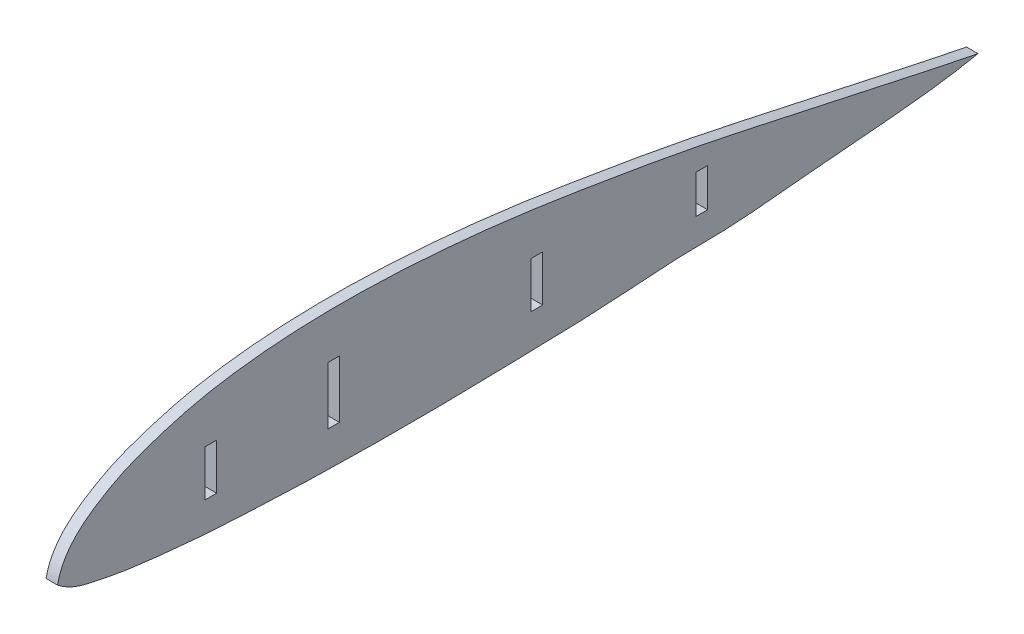
ISO-10303-21;
HEADER;
FILE_DESCRIPTION(('STEP AP214'),'2;1');
FILE_NAME('part.step','',(''),(''),'','','');
FILE_SCHEMA(('AUTOMOTIVE_DESIGN { 1 0 10303 214 1 1 1 1 }'));
ENDSEC;
DATA;
#1=APPLICATION_CONTEXT('core data for automotive mechanical design processes');
#2=APPLICATION_PROTOCOL_DEFINITION('international standard','automotive_design',2000,#1);
#3=PRODUCT_CONTEXT('',#1,'mechanical');
#4=PRODUCT('Part','Part','',(#3));
#5=PRODUCT_RELATED_PRODUCT_CATEGORY('part','',(#4));
#6=PRODUCT_DEFINITION_FORMATION('','',#4);
#7=PRODUCT_DEFINITION_CONTEXT('part definition',#1,'design');
#8=PRODUCT_DEFINITION('design','',#6,#7);
#9=PRODUCT_DEFINITION_SHAPE('','',#8);
#10=(LENGTH_UNIT() NAMED_UNIT(*) SI_UNIT(.MILLI.,.METRE.));
#11=(NAMED_UNIT(*) PLANE_ANGLE_UNIT() SI_UNIT($,.RADIAN.));
#12=(NAMED_UNIT(*) SI_UNIT($,.STERADIAN.) SOLID_ANGLE_UNIT());
#13=UNCERTAINTY_MEASURE_WITH_UNIT(LENGTH_MEASURE(1.E-05),#10,'distance_accuracy_value','');
#14=(GEOMETRIC_REPRESENTATION_CONTEXT(3) GLOBAL_UNCERTAINTY_ASSIGNED_CONTEXT((#13)) GLOBAL_UNIT_ASSIGNED_CONTEXT((#10,
#11,#12)) REPRESENTATION_CONTEXT('',''));
#15=CARTESIAN_POINT('',(0.,0.,0.));
#16=DIRECTION('',(0.,0.,1.));
#17=DIRECTION('',(1.,0.,0.));
#18=AXIS2_PLACEMENT_3D('',#15,#16,#17);
#19=CARTESIAN_POINT('',(3.,0.,240.));
#20=CARTESIAN_POINT('',(3.,-2.88663712280927,236.523911789921));
#21=CARTESIAN_POINT('',(3.,-4.06778606087941,230.220810861395));
#22=CARTESIAN_POINT('',(3.,-5.64877990651582,222.028601874124));
#23=CARTESIAN_POINT('',(3.,-6.60851401532716,214.009642515101));
#24=CARTESIAN_POINT('',(3.,-7.65058139006474,204.019456847261));
#25=CARTESIAN_POINT('',(3.,-8.62100436946901,188.0105436438));
#26=CARTESIAN_POINT('',(3.,-9.35502805275515,168.008371033474));
#27=CARTESIAN_POINT('',(3.,-9.54465584837777,143.997445941081));
#28=CARTESIAN_POINT('',(3.,-9.00057164569615,119.996434597562));
#29=CARTESIAN_POINT('',(3.,-8.45231331914167,95.9841207137069));
#30=CARTESIAN_POINT('',(3.,-6.86154925632092,79.4444514819222));
#31=CARTESIAN_POINT('',(3.,-6.94135781790873,63.4128510279465));
#32=CARTESIAN_POINT('',(3.,-5.14929657813988,47.4214800178839));
#33=CARTESIAN_POINT('',(3.,-3.34616289016771,23.9519910613881));
#34=CARTESIAN_POINT('',(3.,-1.67223814751534,7.91601145609598));
#35=CARTESIAN_POINT('',(3.,0.,0.));
#36=B_SPLINE_CURVE_WITH_KNOTS('',3,(#19,#20,#21,#22,#23,#24,#25,#26,#27,#28,#29,#30,#31,#32,#33,
#34,#35),.UNSPECIFIED.,.F.,.F.,(4,1,1,1,1,1,1,1,1,1,1,1,1,1,4),(0.,0.0534752742490124,
0.078709310431568,0.103753203869046,0.153672751320013,0.203448048800785,0.302856430572072,
0.402198969890009,0.501554024856561,0.600954522211836,0.700430480598882,0.70748041607058,
0.79999645484155,0.899715684831644,1.),.UNSPECIFIED.);
#37=DIRECTION('',(-1.,0.,0.));
#38=VECTOR('',#37,1.);
#39=SURFACE_OF_LINEAR_EXTRUSION('',#36,#38);
#40=CARTESIAN_POINT('',(0.,0.,240.));
#41=CARTESIAN_POINT('',(0.,-2.88663712280927,236.523911789921));
#42=CARTESIAN_POINT('',(0.,-4.06778606087941,230.220810861395));
#43=CARTESIAN_POINT('',(0.,-5.64877990651582,222.028601874124));
#44=CARTESIAN_POINT('',(0.,-6.60851401532716,214.009642515101));
#45=CARTESIAN_POINT('',(0.,-7.65058139006474,204.019456847261));
#46=CARTESIAN_POINT('',(0.,-8.62100436946901,188.0105436438));
#47=CARTESIAN_POINT('',(0.,-9.35502805275515,168.008371033474));
#48=CARTESIAN_POINT('',(0.,-9.54465584837777,143.997445941081));
#49=CARTESIAN_POINT('',(0.,-9.00057164569615,119.996434597562));
#50=CARTESIAN_POINT('',(0.,-8.45231331914167,95.9841207137069));
#51=CARTESIAN_POINT('',(0.,-6.86154925632092,79.4444514819222));
#52=CARTESIAN_POINT('',(0.,-6.94135781790873,63.4128510279465));
#53=CARTESIAN_POINT('',(0.,-5.14929657813988,47.4214800178839));
#54=CARTESIAN_POINT('',(0.,-3.34616289016771,23.9519910613881));
#55=CARTESIAN_POINT('',(0.,-1.67223814751534,7.91601145609598));
#56=CARTESIAN_POINT('',(0.,0.,0.));
#57=B_SPLINE_CURVE_WITH_KNOTS('',3,(#40,#41,#42,#43,#44,#45,#46,#47,#48,#49,#50,#51,#52,#53,#54,
#55,#56),.UNSPECIFIED.,.F.,.F.,(4,1,1,1,1,1,1,1,1,1,1,1,1,1,4),(0.,0.0534752742490124,
0.078709310431568,0.103753203869046,0.153672751320013,0.203448048800785,0.302856430572072,
0.402198969890009,0.501554024856561,0.600954522211836,0.700430480598882,0.70748041607058,
0.79999645484155,0.899715684831644,1.),.UNSPECIFIED.);
#58=CARTESIAN_POINT('',(0.,0.,240.));
#59=VERTEX_POINT('',#58);
#60=CARTESIAN_POINT('',(0.,0.,0.));
#61=VERTEX_POINT('',#60);
#62=EDGE_CURVE('E292',#59,#61,#57,.T.);
#63=ORIENTED_EDGE('',*,*,#62,.T.);
#64=DIRECTION('',(-1.,0.,0.));
#65=VECTOR('',#64,1.);
#66=CARTESIAN_POINT('',(3.,0.,0.));
#67=LINE('',#66,#65);
#68=CARTESIAN_POINT('',(3.,0.,0.));
#69=VERTEX_POINT('',#68);
#70=EDGE_CURVE('E11',#69,#61,#67,.T.);
#71=ORIENTED_EDGE('',*,*,#70,.F.);
#72=CARTESIAN_POINT('',(3.,0.,240.));
#73=VERTEX_POINT('',#72);
#74=EDGE_CURVE('E298',#73,#69,#36,.T.);
#75=ORIENTED_EDGE('',*,*,#74,.F.);
#76=DIRECTION('',(-1.,0.,0.));
#77=VECTOR('',#76,1.);
#78=CARTESIAN_POINT('',(3.,0.,240.));
#79=LINE('',#78,#77);
#80=EDGE_CURVE('E50',#73,#59,#79,.T.);
#81=ORIENTED_EDGE('',*,*,#80,.T.);
#82=EDGE_LOOP('',(#63,#71,#75,#81));
#83=FACE_BOUND('',#82,.T.);
#84=ADVANCED_FACE('F42',(#83),#39,.F.);
#85=CARTESIAN_POINT('',(3.,0.,0.));
#86=CARTESIAN_POINT('',(3.,1.52360068225762,8.03746926130975));
#87=CARTESIAN_POINT('',(3.,5.17138323074117,23.9897917168263));
#88=CARTESIAN_POINT('',(3.,10.2205786034995,48.0059783922376));
#89=CARTESIAN_POINT('',(3.,15.5619770262737,71.9126579513757));
#90=CARTESIAN_POINT('',(3.,19.7588120032883,95.9537600079154));
#91=CARTESIAN_POINT('',(3.,23.5677508672796,119.918298993928));
#92=CARTESIAN_POINT('',(3.,26.0263882263808,143.945589986485));
#93=CARTESIAN_POINT('',(3.,26.9601439821251,168.007150596988));
#94=CARTESIAN_POINT('',(3.,25.8933216802265,188.104616678397));
#95=CARTESIAN_POINT('',(3.,23.2639042392419,204.156129060536));
#96=CARTESIAN_POINT('',(3.,20.3434828261758,214.111867769092));
#97=CARTESIAN_POINT('',(3.,17.4120912155664,222.175332594537));
#98=CARTESIAN_POINT('',(3.,12.3378274401084,231.611968899749));
#99=CARTESIAN_POINT('',(3.,6.88597595591278,238.539586147514));
#100=CARTESIAN_POINT('',(3.,0.,240.));
#101=B_SPLINE_CURVE_WITH_KNOTS('',3,(#85,#86,#87,#88,#89,#90,#91,#92,#93,#94,#95,#96,#97,#98,
#99,#100),.UNSPECIFIED.,.F.,.F.,(4,1,1,1,1,1,1,1,1,1,1,1,1,4),(0.,0.0976537739938577,
0.195364998835535,0.293026196954694,0.390079704897671,0.486695277187024,0.582699676897636,
0.678273314662547,0.77397516907434,0.822435696462195,0.872109787552887,0.897672395288057,
0.924653988799848,1.),.UNSPECIFIED.);
#102=DIRECTION('',(-1.,0.,0.));
#103=VECTOR('',#102,1.);
#104=SURFACE_OF_LINEAR_EXTRUSION('',#101,#103);
#105=CARTESIAN_POINT('',(0.,0.,0.));
#106=CARTESIAN_POINT('',(0.,1.52360068225762,8.03746926130975));
#107=CARTESIAN_POINT('',(0.,5.17138323074117,23.9897917168263));
#108=CARTESIAN_POINT('',(0.,10.2205786034995,48.0059783922376));
#109=CARTESIAN_POINT('',(0.,15.5619770262737,71.9126579513757));
#110=CARTESIAN_POINT('',(0.,19.7588120032883,95.9537600079154));
#111=CARTESIAN_POINT('',(0.,23.5677508672796,119.918298993928));
#112=CARTESIAN_POINT('',(0.,26.0263882263808,143.945589986485));
#113=CARTESIAN_POINT('',(0.,26.9601439821251,168.007150596988));
#114=CARTESIAN_POINT('',(0.,25.8933216802265,188.104616678397));
#115=CARTESIAN_POINT('',(0.,23.2639042392419,204.156129060536));
#116=CARTESIAN_POINT('',(0.,20.3434828261758,214.111867769092));
#117=CARTESIAN_POINT('',(0.,17.4120912155664,222.175332594537));
#118=CARTESIAN_POINT('',(0.,12.3378274401084,231.611968899749));
#119=CARTESIAN_POINT('',(0.,6.88597595591278,238.539586147514));
#120=CARTESIAN_POINT('',(0.,0.,240.));
#121=B_SPLINE_CURVE_WITH_KNOTS('',3,(#105,#106,#107,#108,#109,#110,#111,#112,#113,#114,#115,
#116,#117,#118,#119,#120),.UNSPECIFIED.,.F.,.F.,(4,1,1,1,1,1,1,1,1,1,1,1,1,4),(0.,
0.0976537739938577,0.195364998835535,0.293026196954694,0.390079704897671,0.486695277187024,
0.582699676897636,0.678273314662547,0.77397516907434,0.822435696462195,0.872109787552887,
0.897672395288057,0.924653988799848,1.),.UNSPECIFIED.);
#122=EDGE_CURVE('E305',#61,#59,#121,.T.);
#123=ORIENTED_EDGE('',*,*,#122,.T.);
#124=ORIENTED_EDGE('',*,*,#80,.F.);
#125=EDGE_CURVE('E304',#69,#73,#101,.T.);
#126=ORIENTED_EDGE('',*,*,#125,.F.);
#127=ORIENTED_EDGE('',*,*,#70,.T.);
#128=EDGE_LOOP('',(#123,#124,#126,#127));
#129=FACE_BOUND('',#128,.T.);
#130=ADVANCED_FACE('F319',(#129),#104,.F.);
#131=CARTESIAN_POINT('',(3.,-9.00853891874286,120.375365675922));
#132=DIRECTION('',(-1.,0.,0.));
#133=DIRECTION('',(0.,0.,1.));
#134=AXIS2_PLACEMENT_3D('',#131,#132,#133);
#135=PLANE('',#134);
#136=DIRECTION('',(0.,1.,0.));
#137=VECTOR('',#136,1.);
#138=CARTESIAN_POINT('',(3.,10.,73.5));
#139=LINE('',#138,#137);
#140=CARTESIAN_POINT('',(3.,0.,73.5));
#141=VERTEX_POINT('',#140);
#142=CARTESIAN_POINT('',(3.,10.,73.5));
#143=VERTEX_POINT('',#142);
#144=EDGE_CURVE('E243',#141,#143,#139,.T.);
#145=ORIENTED_EDGE('',*,*,#144,.T.);
#146=DIRECTION('',(0.,0.,-1.));
#147=VECTOR('',#146,1.);
#148=CARTESIAN_POINT('',(3.,10.,70.5));
#149=LINE('',#148,#147);
#150=CARTESIAN_POINT('',(3.,10.,70.5));
#151=VERTEX_POINT('',#150);
#152=EDGE_CURVE('E254',#143,#151,#149,.T.);
#153=ORIENTED_EDGE('',*,*,#152,.T.);
#154=DIRECTION('',(0.,-1.,0.));
#155=VECTOR('',#154,1.);
#156=CARTESIAN_POINT('',(3.,0.,70.5));
#157=LINE('',#156,#155);
#158=CARTESIAN_POINT('',(3.,0.,70.5));
#159=VERTEX_POINT('',#158);
#160=EDGE_CURVE('E264',#151,#159,#157,.T.);
#161=ORIENTED_EDGE('',*,*,#160,.T.);
#162=DIRECTION('',(0.,0.,1.));
#163=VECTOR('',#162,1.);
#164=CARTESIAN_POINT('',(3.,0.,70.5));
#165=LINE('',#164,#163);
#166=EDGE_CURVE('E57',#159,#141,#165,.T.);
#167=ORIENTED_EDGE('',*,*,#166,.T.);
#168=EDGE_LOOP('',(#145,#153,#161,#167));
#169=FACE_BOUND('',#168,.T.);
#170=DIRECTION('',(0.,0.,1.));
#171=VECTOR('',#170,1.);
#172=CARTESIAN_POINT('',(3.,0.,201.5));
#173=LINE('',#172,#171);
#174=CARTESIAN_POINT('',(3.,0.,198.5));
#175=VERTEX_POINT('',#174);
#176=CARTESIAN_POINT('',(3.,0.,201.5));
#177=VERTEX_POINT('',#176);
#178=EDGE_CURVE('E213',#175,#177,#173,.T.);
#179=ORIENTED_EDGE('',*,*,#178,.T.);
#180=DIRECTION('',(0.,1.,0.));
#181=VECTOR('',#180,1.);
#182=CARTESIAN_POINT('',(3.,12.,201.5));
#183=LINE('',#182,#181);
#184=CARTESIAN_POINT('',(3.,12.,201.5));
#185=VERTEX_POINT('',#184);
#186=EDGE_CURVE('E225',#177,#185,#183,.T.);
#187=ORIENTED_EDGE('',*,*,#186,.T.);
#188=DIRECTION('',(0.,0.,-1.));
#189=VECTOR('',#188,1.);
#190=CARTESIAN_POINT('',(3.,12.,198.5));
#191=LINE('',#190,#189);
#192=CARTESIAN_POINT('',(3.,12.,198.5));
#193=VERTEX_POINT('',#192);
#194=EDGE_CURVE('E235',#185,#193,#191,.T.);
#195=ORIENTED_EDGE('',*,*,#194,.T.);
#196=DIRECTION('',(0.,-1.,0.));
#197=VECTOR('',#196,1.);
#198=CARTESIAN_POINT('',(3.,0.,198.5));
#199=LINE('',#198,#197);
#200=EDGE_CURVE('E65',#193,#175,#199,.T.);
#201=ORIENTED_EDGE('',*,*,#200,.T.);
#202=EDGE_LOOP('',(#179,#187,#195,#201));
#203=FACE_BOUND('',#202,.T.);
#204=DIRECTION('',(0.,-1.,0.));
#205=VECTOR('',#204,1.);
#206=CARTESIAN_POINT('',(3.,15.,166.5));
#207=LINE('',#206,#205);
#208=CARTESIAN_POINT('',(3.,15.,166.5));
#209=VERTEX_POINT('',#208);
#210=CARTESIAN_POINT('',(3.,0.,166.5));
#211=VERTEX_POINT('',#210);
#212=EDGE_CURVE('E200',#209,#211,#207,.T.);
#213=ORIENTED_EDGE('',*,*,#212,.T.);
#214=DIRECTION('',(0.,0.,1.));
#215=VECTOR('',#214,1.);
#216=CARTESIAN_POINT('',(3.,0.,166.5));
#217=LINE('',#216,#215);
#218=CARTESIAN_POINT('',(3.,0.,169.5));
#219=VERTEX_POINT('',#218);
#220=EDGE_CURVE('E173',#211,#219,#217,.T.);
#221=ORIENTED_EDGE('',*,*,#220,.T.);
#222=DIRECTION('',(0.,1.,0.));
#223=VECTOR('',#222,1.);
#224=CARTESIAN_POINT('',(3.,0.,169.5));
#225=LINE('',#224,#223);
#226=CARTESIAN_POINT('',(3.,15.,169.5));
#227=VERTEX_POINT('',#226);
#228=EDGE_CURVE('E206',#219,#227,#225,.T.);
#229=ORIENTED_EDGE('',*,*,#228,.T.);
#230=DIRECTION('',(0.,0.,-1.));
#231=VECTOR('',#230,1.);
#232=CARTESIAN_POINT('',(3.,15.,169.5));
#233=LINE('',#232,#231);
#234=EDGE_CURVE('E202',#227,#209,#233,.T.);
#235=ORIENTED_EDGE('',*,*,#234,.T.);
#236=EDGE_LOOP('',(#213,#221,#229,#235));
#237=FACE_BOUND('',#236,.T.);
#238=DIRECTION('',(0.,1.,0.));
#239=VECTOR('',#238,1.);
#240=CARTESIAN_POINT('',(3.,0.,116.5));
#241=LINE('',#240,#239);
#242=CARTESIAN_POINT('',(3.,0.,116.5));
#243=VERTEX_POINT('',#242);
#244=CARTESIAN_POINT('',(3.,12.,116.5));
#245=VERTEX_POINT('',#244);
#246=EDGE_CURVE('E279',#243,#245,#241,.T.);
#247=ORIENTED_EDGE('',*,*,#246,.T.);
#248=DIRECTION('',(0.,0.,-1.));
#249=VECTOR('',#248,1.);
#250=CARTESIAN_POINT('',(3.,12.,116.5));
#251=LINE('',#250,#249);
#252=CARTESIAN_POINT('',(3.,12.,113.5));
#253=VERTEX_POINT('',#252);
#254=EDGE_CURVE('E269',#245,#253,#251,.T.);
#255=ORIENTED_EDGE('',*,*,#254,.T.);
#256=DIRECTION('',(0.,-1.,0.));
#257=VECTOR('',#256,1.);
#258=CARTESIAN_POINT('',(3.,12.,113.5));
#259=LINE('',#258,#257);
#260=CARTESIAN_POINT('',(3.,0.,113.5));
#261=VERTEX_POINT('',#260);
#262=EDGE_CURVE('E272',#253,#261,#259,.T.);
#263=ORIENTED_EDGE('',*,*,#262,.T.);
#264=DIRECTION('',(0.,0.,1.));
#265=VECTOR('',#264,1.);
#266=CARTESIAN_POINT('',(3.,0.,116.5));
#267=LINE('',#266,#265);
#268=EDGE_CURVE('E276',#261,#243,#267,.T.);
#269=ORIENTED_EDGE('',*,*,#268,.T.);
#270=EDGE_LOOP('',(#247,#255,#263,#269));
#271=FACE_BOUND('',#270,.T.);
#272=ORIENTED_EDGE('',*,*,#74,.T.);
#273=ORIENTED_EDGE('',*,*,#125,.T.);
#274=EDGE_LOOP('',(#272,#273));
#275=FACE_BOUND('',#274,.T.);
#276=ADVANCED_FACE('F322',(#169,#203,#237,#271,#275),#135,.F.);
#277=CARTESIAN_POINT('',(0.,-9.00853891874286,120.375365675922));
#278=DIRECTION('',(-1.,0.,0.));
#279=DIRECTION('',(0.,0.,1.));
#280=AXIS2_PLACEMENT_3D('',#277,#278,#279);
#281=PLANE('',#280);
#282=DIRECTION('',(0.,0.,-1.));
#283=VECTOR('',#282,1.);
#284=CARTESIAN_POINT('',(0.,10.,70.5));
#285=LINE('',#284,#283);
#286=CARTESIAN_POINT('',(0.,10.,73.5));
#287=VERTEX_POINT('',#286);
#288=CARTESIAN_POINT('',(0.,10.,70.5));
#289=VERTEX_POINT('',#288);
#290=EDGE_CURVE('E220',#287,#289,#285,.T.);
#291=ORIENTED_EDGE('',*,*,#290,.F.);
#292=DIRECTION('',(0.,1.,0.));
#293=VECTOR('',#292,1.);
#294=CARTESIAN_POINT('',(0.,10.,73.5));
#295=LINE('',#294,#293);
#296=CARTESIAN_POINT('',(0.,0.,73.5));
#297=VERTEX_POINT('',#296);
#298=EDGE_CURVE('E250',#297,#287,#295,.T.);
#299=ORIENTED_EDGE('',*,*,#298,.F.);
#300=DIRECTION('',(0.,0.,1.));
#301=VECTOR('',#300,1.);
#302=CARTESIAN_POINT('',(0.,0.,70.5));
#303=LINE('',#302,#301);
#304=CARTESIAN_POINT('',(0.,0.,70.5));
#305=VERTEX_POINT('',#304);
#306=EDGE_CURVE('E253',#305,#297,#303,.T.);
#307=ORIENTED_EDGE('',*,*,#306,.F.);
#308=DIRECTION('',(0.,-1.,0.));
#309=VECTOR('',#308,1.);
#310=CARTESIAN_POINT('',(0.,0.,70.5));
#311=LINE('',#310,#309);
#312=EDGE_CURVE('E257',#289,#305,#311,.T.);
#313=ORIENTED_EDGE('',*,*,#312,.F.);
#314=EDGE_LOOP('',(#291,#299,#307,#313));
#315=FACE_BOUND('',#314,.T.);
#316=DIRECTION('',(0.,1.,0.));
#317=VECTOR('',#316,1.);
#318=CARTESIAN_POINT('',(0.,12.,201.5));
#319=LINE('',#318,#317);
#320=CARTESIAN_POINT('',(0.,0.,201.5));
#321=VERTEX_POINT('',#320);
#322=CARTESIAN_POINT('',(0.,12.,201.5));
#323=VERTEX_POINT('',#322);
#324=EDGE_CURVE('E178',#321,#323,#319,.T.);
#325=ORIENTED_EDGE('',*,*,#324,.F.);
#326=DIRECTION('',(0.,0.,1.));
#327=VECTOR('',#326,1.);
#328=CARTESIAN_POINT('',(0.,0.,201.5));
#329=LINE('',#328,#327);
#330=CARTESIAN_POINT('',(0.,0.,198.5));
#331=VERTEX_POINT('',#330);
#332=EDGE_CURVE('E221',#331,#321,#329,.T.);
#333=ORIENTED_EDGE('',*,*,#332,.F.);
#334=DIRECTION('',(0.,-1.,0.));
#335=VECTOR('',#334,1.);
#336=CARTESIAN_POINT('',(0.,0.,198.5));
#337=LINE('',#336,#335);
#338=CARTESIAN_POINT('',(0.,12.,198.5));
#339=VERTEX_POINT('',#338);
#340=EDGE_CURVE('E224',#339,#331,#337,.T.);
#341=ORIENTED_EDGE('',*,*,#340,.F.);
#342=DIRECTION('',(0.,0.,-1.));
#343=VECTOR('',#342,1.);
#344=CARTESIAN_POINT('',(0.,12.,198.5));
#345=LINE('',#344,#343);
#346=EDGE_CURVE('E228',#323,#339,#345,.T.);
#347=ORIENTED_EDGE('',*,*,#346,.F.);
#348=EDGE_LOOP('',(#325,#333,#341,#347));
#349=FACE_BOUND('',#348,.T.);
#350=DIRECTION('',(0.,0.,1.));
#351=VECTOR('',#350,1.);
#352=CARTESIAN_POINT('',(0.,0.,166.5));
#353=LINE('',#352,#351);
#354=CARTESIAN_POINT('',(0.,0.,166.5));
#355=VERTEX_POINT('',#354);
#356=CARTESIAN_POINT('',(0.,0.,169.5));
#357=VERTEX_POINT('',#356);
#358=EDGE_CURVE('E170',#355,#357,#353,.T.);
#359=ORIENTED_EDGE('',*,*,#358,.F.);
#360=DIRECTION('',(0.,-1.,0.));
#361=VECTOR('',#360,1.);
#362=CARTESIAN_POINT('',(0.,15.,166.5));
#363=LINE('',#362,#361);
#364=CARTESIAN_POINT('',(0.,15.,166.5));
#365=VERTEX_POINT('',#364);
#366=EDGE_CURVE('E181',#365,#355,#363,.T.);
#367=ORIENTED_EDGE('',*,*,#366,.F.);
#368=DIRECTION('',(0.,0.,-1.));
#369=VECTOR('',#368,1.);
#370=CARTESIAN_POINT('',(0.,15.,169.5));
#371=LINE('',#370,#369);
#372=CARTESIAN_POINT('',(0.,15.,169.5));
#373=VERTEX_POINT('',#372);
#374=EDGE_CURVE('E186',#373,#365,#371,.T.);
#375=ORIENTED_EDGE('',*,*,#374,.F.);
#376=DIRECTION('',(0.,1.,0.));
#377=VECTOR('',#376,1.);
#378=CARTESIAN_POINT('',(0.,0.,169.5));
#379=LINE('',#378,#377);
#380=EDGE_CURVE('E192',#357,#373,#379,.T.);
#381=ORIENTED_EDGE('',*,*,#380,.F.);
#382=EDGE_LOOP('',(#359,#367,#375,#381));
#383=FACE_BOUND('',#382,.T.);
#384=DIRECTION('',(0.,0.,-1.));
#385=VECTOR('',#384,1.);
#386=CARTESIAN_POINT('',(0.,12.,116.5));
#387=LINE('',#386,#385);
#388=CARTESIAN_POINT('',(0.,12.,116.5));
#389=VERTEX_POINT('',#388);
#390=CARTESIAN_POINT('',(0.,12.,113.5));
#391=VERTEX_POINT('',#390);
#392=EDGE_CURVE('E193',#389,#391,#387,.T.);
#393=ORIENTED_EDGE('',*,*,#392,.F.);
#394=DIRECTION('',(0.,1.,0.));
#395=VECTOR('',#394,1.);
#396=CARTESIAN_POINT('',(0.,0.,116.5));
#397=LINE('',#396,#395);
#398=CARTESIAN_POINT('',(0.,0.,116.5));
#399=VERTEX_POINT('',#398);
#400=EDGE_CURVE('E273',#399,#389,#397,.T.);
#401=ORIENTED_EDGE('',*,*,#400,.F.);
#402=DIRECTION('',(0.,0.,1.));
#403=VECTOR('',#402,1.);
#404=CARTESIAN_POINT('',(0.,0.,116.5));
#405=LINE('',#404,#403);
#406=CARTESIAN_POINT('',(0.,0.,113.5));
#407=VERTEX_POINT('',#406);
#408=EDGE_CURVE('E285',#407,#399,#405,.T.);
#409=ORIENTED_EDGE('',*,*,#408,.F.);
#410=DIRECTION('',(0.,-1.,0.));
#411=VECTOR('',#410,1.);
#412=CARTESIAN_POINT('',(0.,12.,113.5));
#413=LINE('',#412,#411);
#414=EDGE_CURVE('E195',#391,#407,#413,.T.);
#415=ORIENTED_EDGE('',*,*,#414,.F.);
#416=EDGE_LOOP('',(#393,#401,#409,#415));
#417=FACE_BOUND('',#416,.T.);
#418=ORIENTED_EDGE('',*,*,#62,.F.);
#419=ORIENTED_EDGE('',*,*,#122,.F.);
#420=EDGE_LOOP('',(#418,#419));
#421=FACE_BOUND('',#420,.T.);
#422=ADVANCED_FACE('F189',(#315,#349,#383,#417,#421),#281,.T.);
#423=CARTESIAN_POINT('',(3.,12.,116.5));
#424=DIRECTION('',(0.,1.,0.));
#425=DIRECTION('',(0.,0.,1.));
#426=AXIS2_PLACEMENT_3D('',#423,#424,#425);
#427=PLANE('',#426);
#428=ORIENTED_EDGE('',*,*,#392,.T.);
#429=DIRECTION('',(-1.,0.,0.));
#430=VECTOR('',#429,1.);
#431=CARTESIAN_POINT('',(3.,12.,113.5));
#432=LINE('',#431,#430);
#433=EDGE_CURVE('E281',#253,#391,#432,.T.);
#434=ORIENTED_EDGE('',*,*,#433,.F.);
#435=ORIENTED_EDGE('',*,*,#254,.F.);
#436=DIRECTION('',(-1.,0.,0.));
#437=VECTOR('',#436,1.);
#438=CARTESIAN_POINT('',(3.,12.,116.5));
#439=LINE('',#438,#437);
#440=EDGE_CURVE('E290',#245,#389,#439,.T.);
#441=ORIENTED_EDGE('',*,*,#440,.T.);
#442=EDGE_LOOP('',(#428,#434,#435,#441));
#443=FACE_BOUND('',#442,.T.);
#444=ADVANCED_FACE('F326',(#443),#427,.F.);
#445=CARTESIAN_POINT('',(3.,0.,116.5));
#446=DIRECTION('',(0.,0.,1.));
#447=DIRECTION('',(1.,0.,0.));
#448=AXIS2_PLACEMENT_3D('',#445,#446,#447);
#449=PLANE('',#448);
#450=ORIENTED_EDGE('',*,*,#400,.T.);
#451=ORIENTED_EDGE('',*,*,#440,.F.);
#452=ORIENTED_EDGE('',*,*,#246,.F.);
#453=DIRECTION('',(-1.,0.,0.));
#454=VECTOR('',#453,1.);
#455=CARTESIAN_POINT('',(3.,0.,116.5));
#456=LINE('',#455,#454);
#457=EDGE_CURVE('E293',#243,#399,#456,.T.);
#458=ORIENTED_EDGE('',*,*,#457,.T.);
#459=EDGE_LOOP('',(#450,#451,#452,#458));
#460=FACE_BOUND('',#459,.T.);
#461=ADVANCED_FACE('F333',(#460),#449,.F.);
#462=CARTESIAN_POINT('',(3.,0.,116.5));
#463=DIRECTION('',(0.,-1.,0.));
#464=DIRECTION('',(0.,0.,-1.));
#465=AXIS2_PLACEMENT_3D('',#462,#463,#464);
#466=PLANE('',#465);
#467=ORIENTED_EDGE('',*,*,#408,.T.);
#468=ORIENTED_EDGE('',*,*,#457,.F.);
#469=ORIENTED_EDGE('',*,*,#268,.F.);
#470=DIRECTION('',(-1.,0.,0.));
#471=VECTOR('',#470,1.);
#472=CARTESIAN_POINT('',(3.,0.,113.5));
#473=LINE('',#472,#471);
#474=EDGE_CURVE('E295',#261,#407,#473,.T.);
#475=ORIENTED_EDGE('',*,*,#474,.T.);
#476=EDGE_LOOP('',(#467,#468,#469,#475));
#477=FACE_BOUND('',#476,.T.);
#478=ADVANCED_FACE('F338',(#477),#466,.F.);
#479=CARTESIAN_POINT('',(3.,12.,113.5));
#480=DIRECTION('',(0.,0.,-1.));
#481=DIRECTION('',(-1.,0.,0.));
#482=AXIS2_PLACEMENT_3D('',#479,#480,#481);
#483=PLANE('',#482);
#484=ORIENTED_EDGE('',*,*,#414,.T.);
#485=ORIENTED_EDGE('',*,*,#474,.F.);
#486=ORIENTED_EDGE('',*,*,#262,.F.);
#487=ORIENTED_EDGE('',*,*,#433,.T.);
#488=EDGE_LOOP('',(#484,#485,#486,#487));
#489=FACE_BOUND('',#488,.T.);
#490=ADVANCED_FACE('F335',(#489),#483,.F.);
#491=CARTESIAN_POINT('',(3.,0.,166.5));
#492=DIRECTION('',(0.,-1.,0.));
#493=DIRECTION('',(0.,0.,-1.));
#494=AXIS2_PLACEMENT_3D('',#491,#492,#493);
#495=PLANE('',#494);
#496=ORIENTED_EDGE('',*,*,#358,.T.);
#497=DIRECTION('',(-1.,0.,0.));
#498=VECTOR('',#497,1.);
#499=CARTESIAN_POINT('',(3.,0.,169.5));
#500=LINE('',#499,#498);
#501=EDGE_CURVE('E203',#219,#357,#500,.T.);
#502=ORIENTED_EDGE('',*,*,#501,.F.);
#503=ORIENTED_EDGE('',*,*,#220,.F.);
#504=DIRECTION('',(-1.,0.,0.));
#505=VECTOR('',#504,1.);
#506=CARTESIAN_POINT('',(3.,0.,166.5));
#507=LINE('',#506,#505);
#508=EDGE_CURVE('E166',#211,#355,#507,.T.);
#509=ORIENTED_EDGE('',*,*,#508,.T.);
#510=EDGE_LOOP('',(#496,#502,#503,#509));
#511=FACE_BOUND('',#510,.T.);
#512=ADVANCED_FACE('F168',(#511),#495,.F.);
#513=CARTESIAN_POINT('',(3.,15.,166.5));
#514=DIRECTION('',(0.,0.,-1.));
#515=DIRECTION('',(-1.,0.,0.));
#516=AXIS2_PLACEMENT_3D('',#513,#514,#515);
#517=PLANE('',#516);
#518=ORIENTED_EDGE('',*,*,#366,.T.);
#519=ORIENTED_EDGE('',*,*,#508,.F.);
#520=ORIENTED_EDGE('',*,*,#212,.F.);
#521=DIRECTION('',(-1.,0.,0.));
#522=VECTOR('',#521,1.);
#523=CARTESIAN_POINT('',(3.,15.,166.5));
#524=LINE('',#523,#522);
#525=EDGE_CURVE('E177',#209,#365,#524,.T.);
#526=ORIENTED_EDGE('',*,*,#525,.T.);
#527=EDGE_LOOP('',(#518,#519,#520,#526));
#528=FACE_BOUND('',#527,.T.);
#529=ADVANCED_FACE('F182',(#528),#517,.F.);
#530=CARTESIAN_POINT('',(3.,15.,169.5));
#531=DIRECTION('',(0.,1.,0.));
#532=DIRECTION('',(0.,0.,1.));
#533=AXIS2_PLACEMENT_3D('',#530,#531,#532);
#534=PLANE('',#533);
#535=ORIENTED_EDGE('',*,*,#374,.T.);
#536=ORIENTED_EDGE('',*,*,#525,.F.);
#537=ORIENTED_EDGE('',*,*,#234,.F.);
#538=DIRECTION('',(-1.,0.,0.));
#539=VECTOR('',#538,1.);
#540=CARTESIAN_POINT('',(3.,15.,169.5));
#541=LINE('',#540,#539);
#542=EDGE_CURVE('E568',#227,#373,#541,.T.);
#543=ORIENTED_EDGE('',*,*,#542,.T.);
#544=EDGE_LOOP('',(#535,#536,#537,#543));
#545=FACE_BOUND('',#544,.T.);
#546=ADVANCED_FACE('F379',(#545),#534,.F.);
#547=CARTESIAN_POINT('',(3.,0.,169.5));
#548=DIRECTION('',(0.,0.,1.));
#549=DIRECTION('',(1.,0.,0.));
#550=AXIS2_PLACEMENT_3D('',#547,#548,#549);
#551=PLANE('',#550);
#552=ORIENTED_EDGE('',*,*,#380,.T.);
#553=ORIENTED_EDGE('',*,*,#542,.F.);
#554=ORIENTED_EDGE('',*,*,#228,.F.);
#555=ORIENTED_EDGE('',*,*,#501,.T.);
#556=EDGE_LOOP('',(#552,#553,#554,#555));
#557=FACE_BOUND('',#556,.T.);
#558=ADVANCED_FACE('F375',(#557),#551,.F.);
#559=CARTESIAN_POINT('',(3.,12.,201.5));
#560=DIRECTION('',(0.,0.,1.));
#561=DIRECTION('',(1.,0.,0.));
#562=AXIS2_PLACEMENT_3D('',#559,#560,#561);
#563=PLANE('',#562);
#564=ORIENTED_EDGE('',*,*,#324,.T.);
#565=DIRECTION('',(-1.,0.,0.));
#566=VECTOR('',#565,1.);
#567=CARTESIAN_POINT('',(3.,12.,201.5));
#568=LINE('',#567,#566);
#569=EDGE_CURVE('E210',#185,#323,#568,.T.);
#570=ORIENTED_EDGE('',*,*,#569,.F.);
#571=ORIENTED_EDGE('',*,*,#186,.F.);
#572=DIRECTION('',(-1.,0.,0.));
#573=VECTOR('',#572,1.);
#574=CARTESIAN_POINT('',(3.,0.,201.5));
#575=LINE('',#574,#573);
#576=EDGE_CURVE('E218',#177,#321,#575,.T.);
#577=ORIENTED_EDGE('',*,*,#576,.T.);
#578=EDGE_LOOP('',(#564,#570,#571,#577));
#579=FACE_BOUND('',#578,.T.);
#580=ADVANCED_FACE('F366',(#579),#563,.F.);
#581=CARTESIAN_POINT('',(3.,0.,201.5));
#582=DIRECTION('',(0.,-1.,0.));
#583=DIRECTION('',(0.,0.,-1.));
#584=AXIS2_PLACEMENT_3D('',#581,#582,#583);
#585=PLANE('',#584);
#586=ORIENTED_EDGE('',*,*,#332,.T.);
#587=ORIENTED_EDGE('',*,*,#576,.F.);
#588=ORIENTED_EDGE('',*,*,#178,.F.);
#589=DIRECTION('',(-1.,0.,0.));
#590=VECTOR('',#589,1.);
#591=CARTESIAN_POINT('',(3.,0.,198.5));
#592=LINE('',#591,#590);
#593=EDGE_CURVE('E216',#175,#331,#592,.T.);
#594=ORIENTED_EDGE('',*,*,#593,.T.);
#595=EDGE_LOOP('',(#586,#587,#588,#594));
#596=FACE_BOUND('',#595,.T.);
#597=ADVANCED_FACE('F362',(#596),#585,.F.);
#598=CARTESIAN_POINT('',(3.,0.,198.5));
#599=DIRECTION('',(0.,0.,-1.));
#600=DIRECTION('',(-1.,0.,0.));
#601=AXIS2_PLACEMENT_3D('',#598,#599,#600);
#602=PLANE('',#601);
#603=ORIENTED_EDGE('',*,*,#340,.T.);
#604=ORIENTED_EDGE('',*,*,#593,.F.);
#605=ORIENTED_EDGE('',*,*,#200,.F.);
#606=DIRECTION('',(-1.,0.,0.));
#607=VECTOR('',#606,1.);
#608=CARTESIAN_POINT('',(3.,12.,198.5));
#609=LINE('',#608,#607);
#610=EDGE_CURVE('E214',#193,#339,#609,.T.);
#611=ORIENTED_EDGE('',*,*,#610,.T.);
#612=EDGE_LOOP('',(#603,#604,#605,#611));
#613=FACE_BOUND('',#612,.T.);
#614=ADVANCED_FACE('F365',(#613),#602,.F.);
#615=CARTESIAN_POINT('',(3.,12.,198.5));
#616=DIRECTION('',(0.,1.,0.));
#617=DIRECTION('',(0.,0.,1.));
#618=AXIS2_PLACEMENT_3D('',#615,#616,#617);
#619=PLANE('',#618);
#620=ORIENTED_EDGE('',*,*,#346,.T.);
#621=ORIENTED_EDGE('',*,*,#610,.F.);
#622=ORIENTED_EDGE('',*,*,#194,.F.);
#623=ORIENTED_EDGE('',*,*,#569,.T.);
#624=EDGE_LOOP('',(#620,#621,#622,#623));
#625=FACE_BOUND('',#624,.T.);
#626=ADVANCED_FACE('F360',(#625),#619,.F.);
#627=CARTESIAN_POINT('',(3.,10.,70.5));
#628=DIRECTION('',(0.,1.,0.));
#629=DIRECTION('',(0.,0.,1.));
#630=AXIS2_PLACEMENT_3D('',#627,#628,#629);
#631=PLANE('',#630);
#632=ORIENTED_EDGE('',*,*,#290,.T.);
#633=DIRECTION('',(-1.,0.,0.));
#634=VECTOR('',#633,1.);
#635=CARTESIAN_POINT('',(3.,10.,70.5));
#636=LINE('',#635,#634);
#637=EDGE_CURVE('E240',#151,#289,#636,.T.);
#638=ORIENTED_EDGE('',*,*,#637,.F.);
#639=ORIENTED_EDGE('',*,*,#152,.F.);
#640=DIRECTION('',(-1.,0.,0.));
#641=VECTOR('',#640,1.);
#642=CARTESIAN_POINT('',(3.,10.,73.5));
#643=LINE('',#642,#641);
#644=EDGE_CURVE('E248',#143,#287,#643,.T.);
#645=ORIENTED_EDGE('',*,*,#644,.T.);
#646=EDGE_LOOP('',(#632,#638,#639,#645));
#647=FACE_BOUND('',#646,.T.);
#648=ADVANCED_FACE('F350',(#647),#631,.F.);
#649=CARTESIAN_POINT('',(3.,10.,73.5));
#650=DIRECTION('',(0.,0.,1.));
#651=DIRECTION('',(1.,0.,0.));
#652=AXIS2_PLACEMENT_3D('',#649,#650,#651);
#653=PLANE('',#652);
#654=ORIENTED_EDGE('',*,*,#298,.T.);
#655=ORIENTED_EDGE('',*,*,#644,.F.);
#656=ORIENTED_EDGE('',*,*,#144,.F.);
#657=DIRECTION('',(-1.,0.,0.));
#658=VECTOR('',#657,1.);
#659=CARTESIAN_POINT('',(3.,0.,73.5));
#660=LINE('',#659,#658);
#661=EDGE_CURVE('E246',#141,#297,#660,.T.);
#662=ORIENTED_EDGE('',*,*,#661,.T.);
#663=EDGE_LOOP('',(#654,#655,#656,#662));
#664=FACE_BOUND('',#663,.T.);
#665=ADVANCED_FACE('F346',(#664),#653,.F.);
#666=CARTESIAN_POINT('',(3.,0.,70.5));
#667=DIRECTION('',(0.,-1.,0.));
#668=DIRECTION('',(0.,0.,-1.));
#669=AXIS2_PLACEMENT_3D('',#666,#667,#668);
#670=PLANE('',#669);
#671=ORIENTED_EDGE('',*,*,#306,.T.);
#672=ORIENTED_EDGE('',*,*,#661,.F.);
#673=ORIENTED_EDGE('',*,*,#166,.F.);
#674=DIRECTION('',(-1.,0.,0.));
#675=VECTOR('',#674,1.);
#676=CARTESIAN_POINT('',(3.,0.,70.5));
#677=LINE('',#676,#675);
#678=EDGE_CURVE('E244',#159,#305,#677,.T.);
#679=ORIENTED_EDGE('',*,*,#678,.T.);
#680=EDGE_LOOP('',(#671,#672,#673,#679));
#681=FACE_BOUND('',#680,.T.);
#682=ADVANCED_FACE('F349',(#681),#670,.F.);
#683=CARTESIAN_POINT('',(3.,0.,70.5));
#684=DIRECTION('',(0.,0.,-1.));
#685=DIRECTION('',(-1.,0.,0.));
#686=AXIS2_PLACEMENT_3D('',#683,#684,#685);
#687=PLANE('',#686);
#688=ORIENTED_EDGE('',*,*,#312,.T.);
#689=ORIENTED_EDGE('',*,*,#678,.F.);
#690=ORIENTED_EDGE('',*,*,#160,.F.);
#691=ORIENTED_EDGE('',*,*,#637,.T.);
#692=EDGE_LOOP('',(#688,#689,#690,#691));
#693=FACE_BOUND('',#692,.T.);
#694=ADVANCED_FACE('F354',(#693),#687,.F.);
#695=CLOSED_SHELL('',(#84,#130,#276,#422,#444,#461,#478,#490,#512,#529,#546,#558,#580,#597,#614,
#626,#648,#665,#682,#694));
#696=MANIFOLD_SOLID_BREP('B2',#695);
#697=ADVANCED_BREP_SHAPE_REPRESENTATION('',(#18,#696),#14);
#698=SHAPE_DEFINITION_REPRESENTATION(#9,#697);
ENDSEC;
END-ISO-10303-21;
